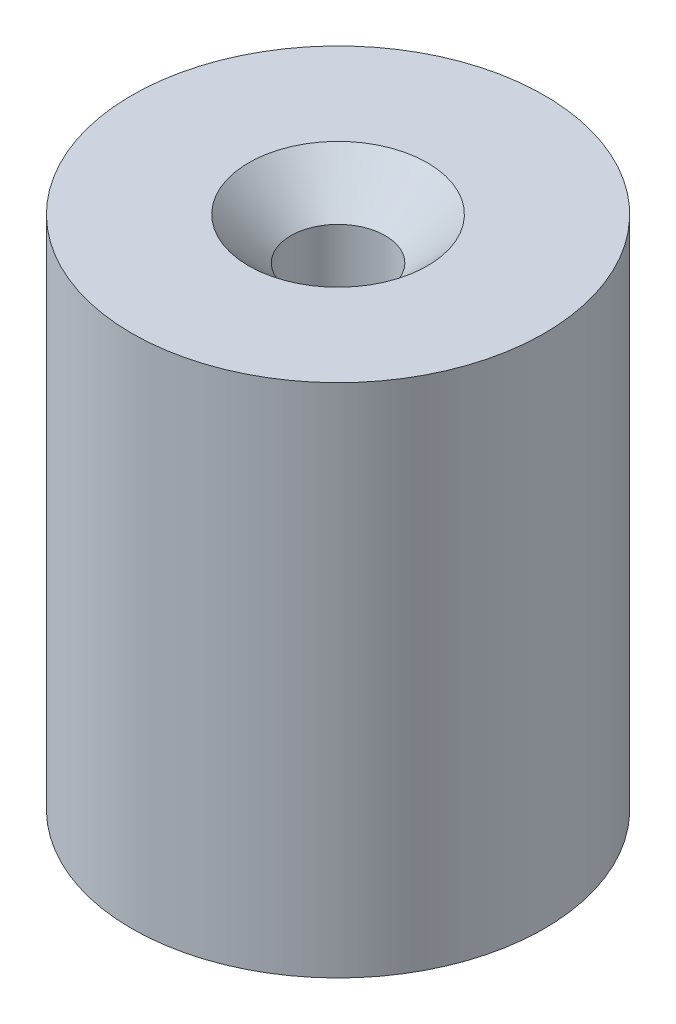
ISO-10303-21;
HEADER;
FILE_DESCRIPTION(('STEP AP214'),'2;1');
FILE_NAME('part.step','',(''),(''),'','','');
FILE_SCHEMA(('AUTOMOTIVE_DESIGN { 1 0 10303 214 1 1 1 1 }'));
ENDSEC;
DATA;
#1=APPLICATION_CONTEXT('core data for automotive mechanical design processes');
#2=APPLICATION_PROTOCOL_DEFINITION('international standard','automotive_design',2000,#1);
#3=PRODUCT_CONTEXT('',#1,'mechanical');
#4=PRODUCT('Part','Part','',(#3));
#5=PRODUCT_RELATED_PRODUCT_CATEGORY('part','',(#4));
#6=PRODUCT_DEFINITION_FORMATION('','',#4);
#7=PRODUCT_DEFINITION_CONTEXT('part definition',#1,'design');
#8=PRODUCT_DEFINITION('design','',#6,#7);
#9=PRODUCT_DEFINITION_SHAPE('','',#8);
#10=(LENGTH_UNIT() NAMED_UNIT(*) SI_UNIT(.MILLI.,.METRE.));
#11=(NAMED_UNIT(*) PLANE_ANGLE_UNIT() SI_UNIT($,.RADIAN.));
#12=(NAMED_UNIT(*) SI_UNIT($,.STERADIAN.) SOLID_ANGLE_UNIT());
#13=UNCERTAINTY_MEASURE_WITH_UNIT(LENGTH_MEASURE(1.E-05),#10,'distance_accuracy_value','');
#14=(GEOMETRIC_REPRESENTATION_CONTEXT(3) GLOBAL_UNCERTAINTY_ASSIGNED_CONTEXT((#13)) GLOBAL_UNIT_ASSIGNED_CONTEXT((#10,
#11,#12)) REPRESENTATION_CONTEXT('',''));
#15=CARTESIAN_POINT('',(0.,0.,0.));
#16=DIRECTION('',(0.,0.,1.));
#17=DIRECTION('',(1.,0.,0.));
#18=AXIS2_PLACEMENT_3D('',#15,#16,#17);
#19=CARTESIAN_POINT('',(0.,30.,0.));
#20=DIRECTION('',(0.,-1.,0.));
#21=DIRECTION('',(0.,0.,-1.));
#22=AXIS2_PLACEMENT_3D('',#19,#20,#21);
#23=CYLINDRICAL_SURFACE('',#22,12.);
#24=CARTESIAN_POINT('',(0.,30.,0.));
#25=DIRECTION('',(0.,1.,0.));
#26=DIRECTION('',(0.,0.,1.));
#27=AXIS2_PLACEMENT_3D('',#24,#25,#26);
#28=CIRCLE('',#27,12.);
#29=CARTESIAN_POINT('',(0.,30.,12.));
#30=VERTEX_POINT('',#29);
#31=EDGE_CURVE('E11',#30,#30,#28,.T.);
#32=ORIENTED_EDGE('',*,*,#31,.F.);
#33=EDGE_LOOP('',(#32));
#34=FACE_BOUND('',#33,.T.);
#35=CARTESIAN_POINT('',(0.,0.,0.));
#36=DIRECTION('',(0.,1.,0.));
#37=DIRECTION('',(0.,0.,1.));
#38=AXIS2_PLACEMENT_3D('',#35,#36,#37);
#39=CIRCLE('',#38,12.);
#40=CARTESIAN_POINT('',(0.,0.,12.));
#41=VERTEX_POINT('',#40);
#42=EDGE_CURVE('E38',#41,#41,#39,.T.);
#43=ORIENTED_EDGE('',*,*,#42,.T.);
#44=EDGE_LOOP('',(#43));
#45=FACE_BOUND('',#44,.T.);
#46=ADVANCED_FACE('F35',(#34,#45),#23,.T.);
#47=CARTESIAN_POINT('',(0.,30.,0.));
#48=DIRECTION('',(0.,1.,0.));
#49=DIRECTION('',(0.,0.,1.));
#50=AXIS2_PLACEMENT_3D('',#47,#48,#49);
#51=PLANE('',#50);
#52=CARTESIAN_POINT('',(0.,30.,0.));
#53=DIRECTION('',(0.,1.,0.));
#54=DIRECTION('',(0.,0.,1.));
#55=AXIS2_PLACEMENT_3D('',#52,#53,#54);
#56=CIRCLE('',#55,5.2);
#57=CARTESIAN_POINT('',(0.,30.,5.2));
#58=VERTEX_POINT('',#57);
#59=EDGE_CURVE('E58',#58,#58,#56,.T.);
#60=ORIENTED_EDGE('',*,*,#59,.F.);
#61=EDGE_LOOP('',(#60));
#62=FACE_BOUND('',#61,.T.);
#63=ORIENTED_EDGE('',*,*,#31,.T.);
#64=EDGE_LOOP('',(#63));
#65=FACE_BOUND('',#64,.T.);
#66=ADVANCED_FACE('F80',(#62,#65),#51,.T.);
#67=CARTESIAN_POINT('',(0.,0.,0.));
#68=DIRECTION('',(0.,1.,0.));
#69=DIRECTION('',(0.,0.,1.));
#70=AXIS2_PLACEMENT_3D('',#67,#68,#69);
#71=PLANE('',#70);
#72=CARTESIAN_POINT('',(0.,0.,0.));
#73=DIRECTION('',(0.,-1.,0.));
#74=DIRECTION('',(0.,0.,-1.));
#75=AXIS2_PLACEMENT_3D('',#72,#73,#74);
#76=CIRCLE('',#75,3.99999999999999);
#77=CARTESIAN_POINT('',(0.,0.,-3.99999999999999));
#78=VERTEX_POINT('',#77);
#79=EDGE_CURVE('E59',#78,#78,#76,.T.);
#80=ORIENTED_EDGE('',*,*,#79,.F.);
#81=EDGE_LOOP('',(#80));
#82=FACE_BOUND('',#81,.T.);
#83=ORIENTED_EDGE('',*,*,#42,.F.);
#84=EDGE_LOOP('',(#83));
#85=FACE_BOUND('',#84,.T.);
#86=ADVANCED_FACE('F77',(#82,#85),#71,.F.);
#87=CARTESIAN_POINT('',(0.,18.,0.));
#88=DIRECTION('',(0.,1.,0.));
#89=DIRECTION('',(0.,0.,1.));
#90=AXIS2_PLACEMENT_3D('',#87,#88,#89);
#91=CONICAL_SURFACE('',#90,2.75,1.02974425867665);
#92=CARTESIAN_POINT('',(0.,16.3476332976742,0.));
#93=VERTEX_POINT('',#92);
#94=VERTEX_LOOP('',#93);
#95=FACE_BOUND('',#94,.T.);
#96=CARTESIAN_POINT('',(0.,18.,0.));
#97=DIRECTION('',(0.,1.,0.));
#98=DIRECTION('',(0.,0.,1.));
#99=AXIS2_PLACEMENT_3D('',#96,#97,#98);
#100=CIRCLE('',#99,2.75);
#101=CARTESIAN_POINT('',(0.,18.,2.75));
#102=VERTEX_POINT('',#101);
#103=EDGE_CURVE('E69',#102,#102,#100,.T.);
#104=ORIENTED_EDGE('',*,*,#103,.T.);
#105=EDGE_LOOP('',(#104));
#106=FACE_BOUND('',#105,.T.);
#107=ADVANCED_FACE('F79',(#95,#106),#91,.F.);
#108=CARTESIAN_POINT('',(0.,30.,0.));
#109=DIRECTION('',(0.,1.,0.));
#110=DIRECTION('',(0.,0.,1.));
#111=AXIS2_PLACEMENT_3D('',#108,#109,#110);
#112=CYLINDRICAL_SURFACE('',#111,2.75);
#113=ORIENTED_EDGE('',*,*,#103,.F.);
#114=EDGE_LOOP('',(#113));
#115=FACE_BOUND('',#114,.T.);
#116=CARTESIAN_POINT('',(0.,27.55,0.));
#117=DIRECTION('',(0.,1.,0.));
#118=DIRECTION('',(0.,0.,1.));
#119=AXIS2_PLACEMENT_3D('',#116,#117,#118);
#120=CIRCLE('',#119,2.75);
#121=CARTESIAN_POINT('',(0.,27.55,2.75));
#122=VERTEX_POINT('',#121);
#123=EDGE_CURVE('E62',#122,#122,#120,.T.);
#124=ORIENTED_EDGE('',*,*,#123,.T.);
#125=EDGE_LOOP('',(#124));
#126=FACE_BOUND('',#125,.T.);
#127=ADVANCED_FACE('F86',(#115,#126),#112,.F.);
#128=CARTESIAN_POINT('',(0.,30.,0.));
#129=DIRECTION('',(0.,1.,0.));
#130=DIRECTION('',(0.,0.,1.));
#131=AXIS2_PLACEMENT_3D('',#128,#129,#130);
#132=CONICAL_SURFACE('',#131,5.2,0.785398163397448);
#133=ORIENTED_EDGE('',*,*,#123,.F.);
#134=EDGE_LOOP('',(#133));
#135=FACE_BOUND('',#134,.T.);
#136=ORIENTED_EDGE('',*,*,#59,.T.);
#137=EDGE_LOOP('',(#136));
#138=FACE_BOUND('',#137,.T.);
#139=ADVANCED_FACE('F52',(#135,#138),#132,.F.);
#140=CARTESIAN_POINT('',(0.,12.,0.));
#141=DIRECTION('',(0.,-1.,0.));
#142=DIRECTION('',(0.,0.,-1.));
#143=AXIS2_PLACEMENT_3D('',#140,#141,#142);
#144=CONICAL_SURFACE('',#143,4.,1.02974425867665);
#145=CARTESIAN_POINT('',(0.,14.4034424761102,0.));
#146=VERTEX_POINT('',#145);
#147=VERTEX_LOOP('',#146);
#148=FACE_BOUND('',#147,.T.);
#149=CARTESIAN_POINT('',(0.,12.,0.));
#150=DIRECTION('',(0.,-1.,0.));
#151=DIRECTION('',(0.,0.,-1.));
#152=AXIS2_PLACEMENT_3D('',#149,#150,#151);
#153=CIRCLE('',#152,4.);
#154=CARTESIAN_POINT('',(0.,12.,-4.));
#155=VERTEX_POINT('',#154);
#156=EDGE_CURVE('E56',#155,#155,#153,.T.);
#157=ORIENTED_EDGE('',*,*,#156,.T.);
#158=EDGE_LOOP('',(#157));
#159=FACE_BOUND('',#158,.T.);
#160=ADVANCED_FACE('F48',(#148,#159),#144,.F.);
#161=CARTESIAN_POINT('',(0.,0.,0.));
#162=DIRECTION('',(0.,-1.,0.));
#163=DIRECTION('',(0.,0.,-1.));
#164=AXIS2_PLACEMENT_3D('',#161,#162,#163);
#165=CYLINDRICAL_SURFACE('',#164,3.99999999999999);
#166=ORIENTED_EDGE('',*,*,#156,.F.);
#167=EDGE_LOOP('',(#166));
#168=FACE_BOUND('',#167,.T.);
#169=ORIENTED_EDGE('',*,*,#79,.T.);
#170=EDGE_LOOP('',(#169));
#171=FACE_BOUND('',#170,.T.);
#172=ADVANCED_FACE('F51',(#168,#171),#165,.F.);
#173=CLOSED_SHELL('',(#46,#66,#86,#107,#127,#139,#160,#172));
#174=MANIFOLD_SOLID_BREP('B2',#173);
#175=ADVANCED_BREP_SHAPE_REPRESENTATION('',(#18,#174),#14);
#176=SHAPE_DEFINITION_REPRESENTATION(#9,#175);
ENDSEC;
END-ISO-10303-21;
